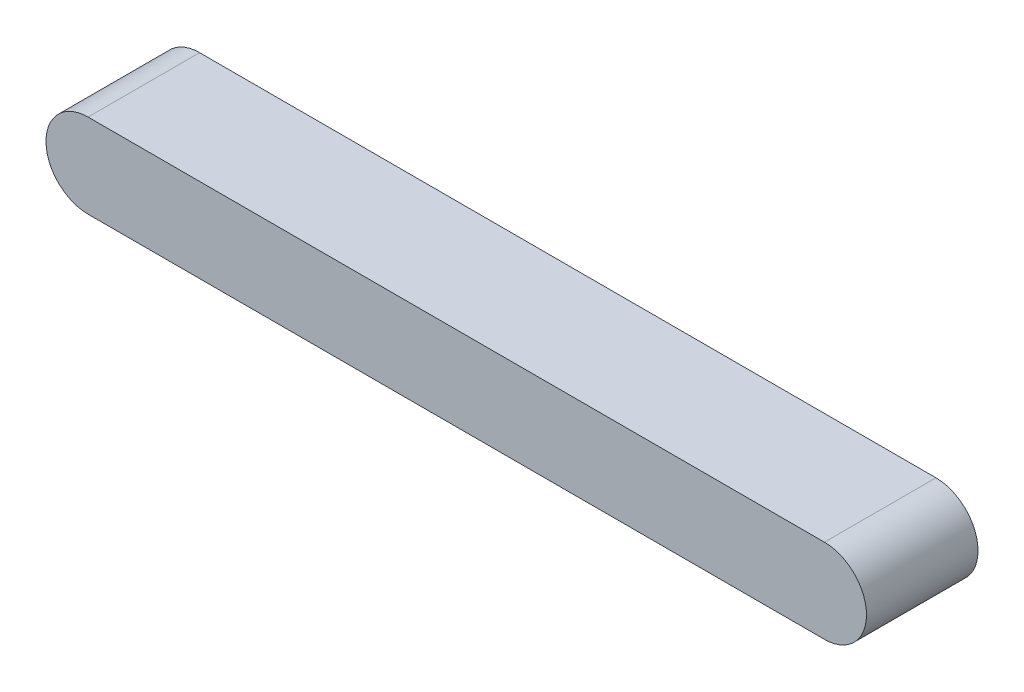
ISO-10303-21;
HEADER;
FILE_DESCRIPTION(('STEP AP214'),'2;1');
FILE_NAME('part.step','',(''),(''),'','','');
FILE_SCHEMA(('AUTOMOTIVE_DESIGN { 1 0 10303 214 1 1 1 1 }'));
ENDSEC;
DATA;
#1=APPLICATION_CONTEXT('core data for automotive mechanical design processes');
#2=APPLICATION_PROTOCOL_DEFINITION('international standard','automotive_design',2000,#1);
#3=PRODUCT_CONTEXT('',#1,'mechanical');
#4=PRODUCT('Part','Part','',(#3));
#5=PRODUCT_RELATED_PRODUCT_CATEGORY('part','',(#4));
#6=PRODUCT_DEFINITION_FORMATION('','',#4);
#7=PRODUCT_DEFINITION_CONTEXT('part definition',#1,'design');
#8=PRODUCT_DEFINITION('design','',#6,#7);
#9=PRODUCT_DEFINITION_SHAPE('','',#8);
#10=(LENGTH_UNIT() NAMED_UNIT(*) SI_UNIT(.MILLI.,.METRE.));
#11=(NAMED_UNIT(*) PLANE_ANGLE_UNIT() SI_UNIT($,.RADIAN.));
#12=(NAMED_UNIT(*) SI_UNIT($,.STERADIAN.) SOLID_ANGLE_UNIT());
#13=UNCERTAINTY_MEASURE_WITH_UNIT(LENGTH_MEASURE(1.E-05),#10,'distance_accuracy_value','');
#14=(GEOMETRIC_REPRESENTATION_CONTEXT(3) GLOBAL_UNCERTAINTY_ASSIGNED_CONTEXT((#13)) GLOBAL_UNIT_ASSIGNED_CONTEXT((#10,
#11,#12)) REPRESENTATION_CONTEXT('',''));
#15=CARTESIAN_POINT('',(0.,0.,0.));
#16=DIRECTION('',(0.,0.,1.));
#17=DIRECTION('',(1.,0.,0.));
#18=AXIS2_PLACEMENT_3D('',#15,#16,#17);
#19=CARTESIAN_POINT('',(0.,0.,5.3));
#20=DIRECTION('',(0.,0.,-1.));
#21=DIRECTION('',(-1.,0.,0.));
#22=AXIS2_PLACEMENT_3D('',#19,#20,#21);
#23=CYLINDRICAL_SURFACE('',#22,2.);
#24=CARTESIAN_POINT('',(0.,0.,0.));
#25=DIRECTION('',(0.,0.,1.));
#26=DIRECTION('',(1.,0.,0.));
#27=AXIS2_PLACEMENT_3D('',#24,#25,#26);
#28=CIRCLE('',#27,2.);
#29=CARTESIAN_POINT('',(0.,2.,0.));
#30=VERTEX_POINT('',#29);
#31=CARTESIAN_POINT('',(0.,-2.,0.));
#32=VERTEX_POINT('',#31);
#33=EDGE_CURVE('E96',#30,#32,#28,.T.);
#34=ORIENTED_EDGE('',*,*,#33,.T.);
#35=DIRECTION('',(0.,0.,-1.));
#36=VECTOR('',#35,1.);
#37=CARTESIAN_POINT('',(0.,-2.,5.3));
#38=LINE('',#37,#36);
#39=CARTESIAN_POINT('',(0.,-2.,5.3));
#40=VERTEX_POINT('',#39);
#41=EDGE_CURVE('E11',#40,#32,#38,.T.);
#42=ORIENTED_EDGE('',*,*,#41,.F.);
#43=CARTESIAN_POINT('',(0.,0.,5.3));
#44=DIRECTION('',(0.,0.,1.));
#45=DIRECTION('',(1.,0.,0.));
#46=AXIS2_PLACEMENT_3D('',#43,#44,#45);
#47=CIRCLE('',#46,2.);
#48=CARTESIAN_POINT('',(0.,2.,5.3));
#49=VERTEX_POINT('',#48);
#50=EDGE_CURVE('E84',#49,#40,#47,.T.);
#51=ORIENTED_EDGE('',*,*,#50,.F.);
#52=DIRECTION('',(0.,0.,-1.));
#53=VECTOR('',#52,1.);
#54=CARTESIAN_POINT('',(0.,2.,5.3));
#55=LINE('',#54,#53);
#56=EDGE_CURVE('E92',#49,#30,#55,.T.);
#57=ORIENTED_EDGE('',*,*,#56,.T.);
#58=EDGE_LOOP('',(#34,#42,#51,#57));
#59=FACE_BOUND('',#58,.T.);
#60=ADVANCED_FACE('F33',(#59),#23,.T.);
#61=CARTESIAN_POINT('',(0.,-2.,5.3));
#62=DIRECTION('',(0.,1.,0.));
#63=DIRECTION('',(0.,0.,1.));
#64=AXIS2_PLACEMENT_3D('',#61,#62,#63);
#65=PLANE('',#64);
#66=DIRECTION('',(1.,0.,0.));
#67=VECTOR('',#66,1.);
#68=CARTESIAN_POINT('',(0.,-2.,0.));
#69=LINE('',#68,#67);
#70=CARTESIAN_POINT('',(35.,-2.,0.));
#71=VERTEX_POINT('',#70);
#72=EDGE_CURVE('E88',#32,#71,#69,.T.);
#73=ORIENTED_EDGE('',*,*,#72,.T.);
#74=DIRECTION('',(0.,0.,-1.));
#75=VECTOR('',#74,1.);
#76=CARTESIAN_POINT('',(35.,-2.,5.3));
#77=LINE('',#76,#75);
#78=CARTESIAN_POINT('',(35.,-2.,5.3));
#79=VERTEX_POINT('',#78);
#80=EDGE_CURVE('E41',#79,#71,#77,.T.);
#81=ORIENTED_EDGE('',*,*,#80,.F.);
#82=DIRECTION('',(1.,0.,0.));
#83=VECTOR('',#82,1.);
#84=CARTESIAN_POINT('',(0.,-2.,5.3));
#85=LINE('',#84,#83);
#86=EDGE_CURVE('E79',#40,#79,#85,.T.);
#87=ORIENTED_EDGE('',*,*,#86,.F.);
#88=ORIENTED_EDGE('',*,*,#41,.T.);
#89=EDGE_LOOP('',(#73,#81,#87,#88));
#90=FACE_BOUND('',#89,.T.);
#91=ADVANCED_FACE('F87',(#90),#65,.F.);
#92=CARTESIAN_POINT('',(35.,0.,5.3));
#93=DIRECTION('',(0.,0.,-1.));
#94=DIRECTION('',(-1.,0.,0.));
#95=AXIS2_PLACEMENT_3D('',#92,#93,#94);
#96=CYLINDRICAL_SURFACE('',#95,2.);
#97=CARTESIAN_POINT('',(35.,0.,0.));
#98=DIRECTION('',(0.,0.,1.));
#99=DIRECTION('',(1.,0.,0.));
#100=AXIS2_PLACEMENT_3D('',#97,#98,#99);
#101=CIRCLE('',#100,2.);
#102=CARTESIAN_POINT('',(35.,2.,0.));
#103=VERTEX_POINT('',#102);
#104=EDGE_CURVE('E66',#71,#103,#101,.T.);
#105=ORIENTED_EDGE('',*,*,#104,.T.);
#106=DIRECTION('',(0.,0.,-1.));
#107=VECTOR('',#106,1.);
#108=CARTESIAN_POINT('',(35.,2.,5.3));
#109=LINE('',#108,#107);
#110=CARTESIAN_POINT('',(35.,2.,5.3));
#111=VERTEX_POINT('',#110);
#112=EDGE_CURVE('E89',#111,#103,#109,.T.);
#113=ORIENTED_EDGE('',*,*,#112,.F.);
#114=CARTESIAN_POINT('',(35.,0.,5.3));
#115=DIRECTION('',(0.,0.,1.));
#116=DIRECTION('',(1.,0.,0.));
#117=AXIS2_PLACEMENT_3D('',#114,#115,#116);
#118=CIRCLE('',#117,2.);
#119=EDGE_CURVE('E82',#79,#111,#118,.T.);
#120=ORIENTED_EDGE('',*,*,#119,.F.);
#121=ORIENTED_EDGE('',*,*,#80,.T.);
#122=EDGE_LOOP('',(#105,#113,#120,#121));
#123=FACE_BOUND('',#122,.T.);
#124=ADVANCED_FACE('F90',(#123),#96,.T.);
#125=CARTESIAN_POINT('',(0.,2.,5.3));
#126=DIRECTION('',(0.,-1.,0.));
#127=DIRECTION('',(0.,0.,-1.));
#128=AXIS2_PLACEMENT_3D('',#125,#126,#127);
#129=PLANE('',#128);
#130=DIRECTION('',(-1.,0.,0.));
#131=VECTOR('',#130,1.);
#132=CARTESIAN_POINT('',(0.,2.,0.));
#133=LINE('',#132,#131);
#134=EDGE_CURVE('E72',#103,#30,#133,.T.);
#135=ORIENTED_EDGE('',*,*,#134,.T.);
#136=ORIENTED_EDGE('',*,*,#56,.F.);
#137=DIRECTION('',(-1.,0.,0.));
#138=VECTOR('',#137,1.);
#139=CARTESIAN_POINT('',(0.,2.,5.3));
#140=LINE('',#139,#138);
#141=EDGE_CURVE('E49',#111,#49,#140,.T.);
#142=ORIENTED_EDGE('',*,*,#141,.F.);
#143=ORIENTED_EDGE('',*,*,#112,.T.);
#144=EDGE_LOOP('',(#135,#136,#142,#143));
#145=FACE_BOUND('',#144,.T.);
#146=ADVANCED_FACE('F103',(#145),#129,.F.);
#147=CARTESIAN_POINT('',(0.,0.,5.3));
#148=DIRECTION('',(0.,0.,1.));
#149=DIRECTION('',(1.,0.,0.));
#150=AXIS2_PLACEMENT_3D('',#147,#148,#149);
#151=PLANE('',#150);
#152=ORIENTED_EDGE('',*,*,#50,.T.);
#153=ORIENTED_EDGE('',*,*,#86,.T.);
#154=ORIENTED_EDGE('',*,*,#119,.T.);
#155=ORIENTED_EDGE('',*,*,#141,.T.);
#156=EDGE_LOOP('',(#152,#153,#154,#155));
#157=FACE_BOUND('',#156,.T.);
#158=ADVANCED_FACE('F80',(#157),#151,.T.);
#159=CARTESIAN_POINT('',(0.,0.,0.));
#160=DIRECTION('',(0.,0.,1.));
#161=DIRECTION('',(1.,0.,0.));
#162=AXIS2_PLACEMENT_3D('',#159,#160,#161);
#163=PLANE('',#162);
#164=ORIENTED_EDGE('',*,*,#33,.F.);
#165=ORIENTED_EDGE('',*,*,#134,.F.);
#166=ORIENTED_EDGE('',*,*,#104,.F.);
#167=ORIENTED_EDGE('',*,*,#72,.F.);
#168=EDGE_LOOP('',(#164,#165,#166,#167));
#169=FACE_BOUND('',#168,.T.);
#170=ADVANCED_FACE('F106',(#169),#163,.F.);
#171=CLOSED_SHELL('',(#60,#91,#124,#146,#158,#170));
#172=MANIFOLD_SOLID_BREP('B2',#171);
#173=ADVANCED_BREP_SHAPE_REPRESENTATION('',(#18,#172),#14);
#174=SHAPE_DEFINITION_REPRESENTATION(#9,#173);
ENDSEC;
END-ISO-10303-21;
